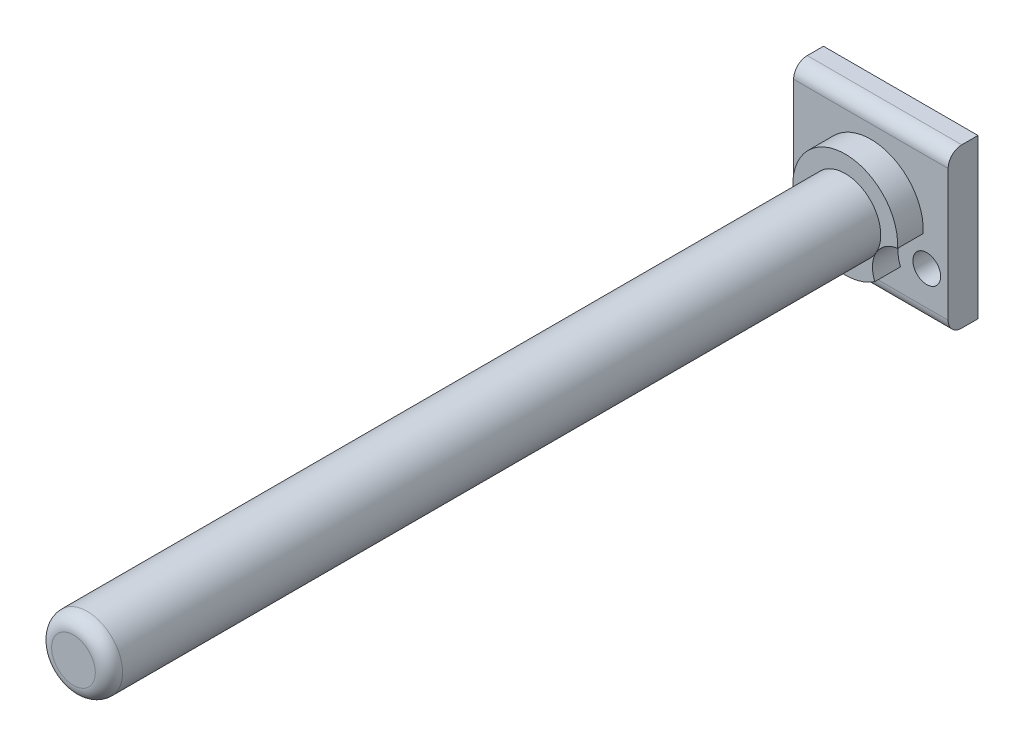
ISO-10303-21;
HEADER;
FILE_DESCRIPTION(('STEP AP214'),'2;1');
FILE_NAME('part.step','',(''),(''),'','','');
FILE_SCHEMA(('AUTOMOTIVE_DESIGN { 1 0 10303 214 1 1 1 1 }'));
ENDSEC;
DATA;
#1=APPLICATION_CONTEXT('core data for automotive mechanical design processes');
#2=APPLICATION_PROTOCOL_DEFINITION('international standard','automotive_design',2000,#1);
#3=PRODUCT_CONTEXT('',#1,'mechanical');
#4=PRODUCT('Part','Part','',(#3));
#5=PRODUCT_RELATED_PRODUCT_CATEGORY('part','',(#4));
#6=PRODUCT_DEFINITION_FORMATION('','',#4);
#7=PRODUCT_DEFINITION_CONTEXT('part definition',#1,'design');
#8=PRODUCT_DEFINITION('design','',#6,#7);
#9=PRODUCT_DEFINITION_SHAPE('','',#8);
#10=(LENGTH_UNIT() NAMED_UNIT(*) SI_UNIT(.MILLI.,.METRE.));
#11=(NAMED_UNIT(*) PLANE_ANGLE_UNIT() SI_UNIT($,.RADIAN.));
#12=(NAMED_UNIT(*) SI_UNIT($,.STERADIAN.) SOLID_ANGLE_UNIT());
#13=UNCERTAINTY_MEASURE_WITH_UNIT(LENGTH_MEASURE(1.E-05),#10,'distance_accuracy_value','');
#14=(GEOMETRIC_REPRESENTATION_CONTEXT(3) GLOBAL_UNCERTAINTY_ASSIGNED_CONTEXT((#13)) GLOBAL_UNIT_ASSIGNED_CONTEXT((#10,
#11,#12)) REPRESENTATION_CONTEXT('',''));
#15=CARTESIAN_POINT('',(0.,0.,0.));
#16=DIRECTION('',(0.,0.,1.));
#17=DIRECTION('',(1.,0.,0.));
#18=AXIS2_PLACEMENT_3D('',#15,#16,#17);
#19=CARTESIAN_POINT('',(0.,0.,3.5));
#20=DIRECTION('',(0.,0.,1.));
#21=DIRECTION('',(1.,0.,0.));
#22=AXIS2_PLACEMENT_3D('',#19,#20,#21);
#23=CYLINDRICAL_SURFACE('',#22,4.16);
#24=CARTESIAN_POINT('',(0.,0.,95.3));
#25=DIRECTION('',(0.,0.,1.));
#26=DIRECTION('',(1.,0.,0.));
#27=AXIS2_PLACEMENT_3D('',#24,#25,#26);
#28=CIRCLE('',#27,4.16);
#29=CARTESIAN_POINT('',(4.16,0.,95.3));
#30=VERTEX_POINT('',#29);
#31=EDGE_CURVE('E318',#30,#30,#28,.F.);
#32=ORIENTED_EDGE('',*,*,#31,.T.);
#33=EDGE_LOOP('',(#32));
#34=FACE_BOUND('',#33,.T.);
#35=CARTESIAN_POINT('',(0.,0.,6.5));
#36=DIRECTION('',(0.,0.,1.));
#37=DIRECTION('',(1.,0.,0.));
#38=AXIS2_PLACEMENT_3D('',#35,#36,#37);
#39=CIRCLE('',#38,4.16);
#40=CARTESIAN_POINT('',(3.62087198898362,-2.04814209453196,6.5));
#41=VERTEX_POINT('',#40);
#42=CARTESIAN_POINT('',(-3.62087198898362,-2.04814209453196,6.5));
#43=VERTEX_POINT('',#42);
#44=EDGE_CURVE('E192',#41,#43,#39,.T.);
#45=ORIENTED_EDGE('',*,*,#44,.T.);
#46=CARTESIAN_POINT('',(0.,0.,6.5));
#47=DIRECTION('',(0.,0.,1.));
#48=DIRECTION('',(1.,0.,0.));
#49=AXIS2_PLACEMENT_3D('',#46,#47,#48);
#50=CIRCLE('',#49,4.16);
#51=EDGE_CURVE('E176',#43,#41,#50,.T.);
#52=ORIENTED_EDGE('',*,*,#51,.T.);
#53=EDGE_LOOP('',(#45,#52));
#54=FACE_BOUND('',#53,.T.);
#55=ADVANCED_FACE('F16',(#34,#54),#23,.T.);
#56=CARTESIAN_POINT('',(6.55,-9.3,1.9));
#57=DIRECTION('',(0.,-1.,0.));
#58=DIRECTION('',(0.,0.,-1.));
#59=AXIS2_PLACEMENT_3D('',#56,#57,#58);
#60=PLANE('',#59);
#61=DIRECTION('',(0.,0.,-1.));
#62=VECTOR('',#61,1.);
#63=CARTESIAN_POINT('',(9.05,-9.3,1.9));
#64=LINE('',#63,#62);
#65=CARTESIAN_POINT('',(9.05,-9.3,1.9));
#66=VERTEX_POINT('',#65);
#67=CARTESIAN_POINT('',(9.05,-9.3,0.));
#68=VERTEX_POINT('',#67);
#69=EDGE_CURVE('E292',#66,#68,#64,.T.);
#70=ORIENTED_EDGE('',*,*,#69,.F.);
#71=DIRECTION('',(-1.,0.,0.));
#72=VECTOR('',#71,1.);
#73=CARTESIAN_POINT('',(6.55,-9.3,1.9));
#74=LINE('',#73,#72);
#75=CARTESIAN_POINT('',(4.05,-9.3,1.9));
#76=VERTEX_POINT('',#75);
#77=EDGE_CURVE('E10',#66,#76,#74,.T.);
#78=ORIENTED_EDGE('',*,*,#77,.T.);
#79=DIRECTION('',(0.,0.,-1.));
#80=VECTOR('',#79,1.);
#81=CARTESIAN_POINT('',(4.05,-9.3,1.9));
#82=LINE('',#81,#80);
#83=CARTESIAN_POINT('',(4.05,-9.3,0.));
#84=VERTEX_POINT('',#83);
#85=EDGE_CURVE('E295',#76,#84,#82,.T.);
#86=ORIENTED_EDGE('',*,*,#85,.T.);
#87=DIRECTION('',(-1.,0.,0.));
#88=VECTOR('',#87,1.);
#89=CARTESIAN_POINT('',(6.55,-9.3,0.));
#90=LINE('',#89,#88);
#91=EDGE_CURVE('E283',#68,#84,#90,.T.);
#92=ORIENTED_EDGE('',*,*,#91,.F.);
#93=EDGE_LOOP('',(#70,#78,#86,#92));
#94=FACE_BOUND('',#93,.T.);
#95=ADVANCED_FACE('F385',(#94),#60,.T.);
#96=CARTESIAN_POINT('',(0.,0.,0.));
#97=DIRECTION('',(0.,0.,1.));
#98=DIRECTION('',(1.,0.,0.));
#99=AXIS2_PLACEMENT_3D('',#96,#97,#98);
#100=PLANE('',#99);
#101=DIRECTION('',(-1.,0.,0.));
#102=VECTOR('',#101,1.);
#103=CARTESIAN_POINT('',(0.,9.3,0.));
#104=LINE('',#103,#102);
#105=CARTESIAN_POINT('',(9.05,9.3,0.));
#106=VERTEX_POINT('',#105);
#107=CARTESIAN_POINT('',(-9.05,9.3,0.));
#108=VERTEX_POINT('',#107);
#109=EDGE_CURVE('E264',#106,#108,#104,.T.);
#110=ORIENTED_EDGE('',*,*,#109,.F.);
#111=DIRECTION('',(0.,-1.,0.));
#112=VECTOR('',#111,1.);
#113=CARTESIAN_POINT('',(9.05,0.,0.));
#114=LINE('',#113,#112);
#115=EDGE_CURVE('E253',#106,#68,#114,.T.);
#116=ORIENTED_EDGE('',*,*,#115,.T.);
#117=ORIENTED_EDGE('',*,*,#91,.T.);
#118=DIRECTION('',(0.,1.,0.));
#119=VECTOR('',#118,1.);
#120=CARTESIAN_POINT('',(4.05,-2.775,0.));
#121=LINE('',#120,#119);
#122=CARTESIAN_POINT('',(4.05,3.75,0.));
#123=VERTEX_POINT('',#122);
#124=EDGE_CURVE('E279',#84,#123,#121,.T.);
#125=ORIENTED_EDGE('',*,*,#124,.T.);
#126=DIRECTION('',(1.,0.,0.));
#127=VECTOR('',#126,1.);
#128=CARTESIAN_POINT('',(0.,3.75,0.));
#129=LINE('',#128,#127);
#130=CARTESIAN_POINT('',(-4.05,3.75,0.));
#131=VERTEX_POINT('',#130);
#132=EDGE_CURVE('E248',#131,#123,#129,.T.);
#133=ORIENTED_EDGE('',*,*,#132,.F.);
#134=DIRECTION('',(0.,1.,0.));
#135=VECTOR('',#134,1.);
#136=CARTESIAN_POINT('',(-4.05,-2.775,0.));
#137=LINE('',#136,#135);
#138=CARTESIAN_POINT('',(-4.05,-9.3,0.));
#139=VERTEX_POINT('',#138);
#140=EDGE_CURVE('E268',#139,#131,#137,.T.);
#141=ORIENTED_EDGE('',*,*,#140,.F.);
#142=DIRECTION('',(-1.,0.,0.));
#143=VECTOR('',#142,1.);
#144=CARTESIAN_POINT('',(-6.55,-9.3,0.));
#145=LINE('',#144,#143);
#146=CARTESIAN_POINT('',(-9.05,-9.3,0.));
#147=VERTEX_POINT('',#146);
#148=EDGE_CURVE('E275',#139,#147,#145,.T.);
#149=ORIENTED_EDGE('',*,*,#148,.T.);
#150=DIRECTION('',(0.,-1.,0.));
#151=VECTOR('',#150,1.);
#152=CARTESIAN_POINT('',(-9.05,0.,0.));
#153=LINE('',#152,#151);
#154=EDGE_CURVE('E271',#108,#147,#153,.T.);
#155=ORIENTED_EDGE('',*,*,#154,.F.);
#156=EDGE_LOOP('',(#110,#116,#117,#125,#133,#141,#149,#155));
#157=FACE_BOUND('',#156,.T.);
#158=CARTESIAN_POINT('',(-6.55,-3.705,0.));
#159=DIRECTION('',(0.,0.,1.));
#160=DIRECTION('',(-1.,0.,0.));
#161=AXIS2_PLACEMENT_3D('',#158,#159,#160);
#162=CIRCLE('',#161,1.625);
#163=CARTESIAN_POINT('',(-8.175,-3.705,0.));
#164=VERTEX_POINT('',#163);
#165=EDGE_CURVE('E231',#164,#164,#162,.T.);
#166=ORIENTED_EDGE('',*,*,#165,.T.);
#167=EDGE_LOOP('',(#166));
#168=FACE_BOUND('',#167,.T.);
#169=CARTESIAN_POINT('',(6.55,-3.705,0.));
#170=DIRECTION('',(0.,0.,-1.));
#171=DIRECTION('',(-1.,0.,0.));
#172=AXIS2_PLACEMENT_3D('',#169,#170,#171);
#173=CIRCLE('',#172,1.625);
#174=CARTESIAN_POINT('',(4.925,-3.705,0.));
#175=VERTEX_POINT('',#174);
#176=EDGE_CURVE('E222',#175,#175,#173,.T.);
#177=ORIENTED_EDGE('',*,*,#176,.F.);
#178=EDGE_LOOP('',(#177));
#179=FACE_BOUND('',#178,.T.);
#180=ADVANCED_FACE('F381',(#157,#168,#179),#100,.F.);
#181=CARTESIAN_POINT('',(0.,0.,3.5));
#182=DIRECTION('',(0.,0.,1.));
#183=DIRECTION('',(1.,0.,0.));
#184=AXIS2_PLACEMENT_3D('',#181,#182,#183);
#185=PLANE('',#184);
#186=CARTESIAN_POINT('',(6.55,-3.705,3.5));
#187=DIRECTION('',(0.,0.,1.));
#188=DIRECTION('',(1.,0.,0.));
#189=AXIS2_PLACEMENT_3D('',#186,#187,#188);
#190=CIRCLE('',#189,3.36525913175088);
#191=CARTESIAN_POINT('',(3.47152484465347,-5.06439683012239,3.5));
#192=VERTEX_POINT('',#191);
#193=CARTESIAN_POINT('',(6.12907169299886,-0.366169608351176,3.5));
#194=VERTEX_POINT('',#193);
#195=EDGE_CURVE('E214',#192,#194,#190,.F.);
#196=ORIENTED_EDGE('',*,*,#195,.F.);
#197=CARTESIAN_POINT('',(0.,0.,3.5));
#198=DIRECTION('',(0.,0.,1.));
#199=DIRECTION('',(1.,0.,0.));
#200=AXIS2_PLACEMENT_3D('',#197,#198,#199);
#201=CIRCLE('',#200,6.14);
#202=CARTESIAN_POINT('',(-3.47152484465347,-5.06439683012239,3.5));
#203=VERTEX_POINT('',#202);
#204=EDGE_CURVE('E187',#192,#203,#201,.F.);
#205=ORIENTED_EDGE('',*,*,#204,.T.);
#206=CARTESIAN_POINT('',(-6.55,-3.705,3.5));
#207=DIRECTION('',(0.,0.,1.));
#208=DIRECTION('',(1.,0.,0.));
#209=AXIS2_PLACEMENT_3D('',#206,#207,#208);
#210=CIRCLE('',#209,3.36525913175088);
#211=CARTESIAN_POINT('',(-6.12907169299886,-0.366169608351175,3.5));
#212=VERTEX_POINT('',#211);
#213=EDGE_CURVE('E37',#212,#203,#210,.F.);
#214=ORIENTED_EDGE('',*,*,#213,.F.);
#215=CARTESIAN_POINT('',(0.,0.,3.5));
#216=DIRECTION('',(0.,0.,1.));
#217=DIRECTION('',(1.,0.,0.));
#218=AXIS2_PLACEMENT_3D('',#215,#216,#217);
#219=CIRCLE('',#218,6.14);
#220=EDGE_CURVE('E215',#212,#194,#219,.F.);
#221=ORIENTED_EDGE('',*,*,#220,.T.);
#222=EDGE_LOOP('',(#196,#205,#214,#221));
#223=FACE_BOUND('',#222,.T.);
#224=CARTESIAN_POINT('',(-6.55,-3.705,3.5));
#225=DIRECTION('',(0.,0.,1.));
#226=DIRECTION('',(1.,0.,0.));
#227=AXIS2_PLACEMENT_3D('',#224,#225,#226);
#228=CIRCLE('',#227,1.625);
#229=CARTESIAN_POINT('',(-4.925,-3.705,3.5));
#230=VERTEX_POINT('',#229);
#231=EDGE_CURVE('E218',#230,#230,#228,.T.);
#232=ORIENTED_EDGE('',*,*,#231,.F.);
#233=EDGE_LOOP('',(#232));
#234=FACE_BOUND('',#233,.T.);
#235=DIRECTION('',(0.,-1.,0.));
#236=VECTOR('',#235,1.);
#237=CARTESIAN_POINT('',(9.05,0.,3.5));
#238=LINE('',#237,#236);
#239=CARTESIAN_POINT('',(9.05,7.7,3.5));
#240=VERTEX_POINT('',#239);
#241=CARTESIAN_POINT('',(9.05,-7.7,3.5));
#242=VERTEX_POINT('',#241);
#243=EDGE_CURVE('E226',#240,#242,#238,.T.);
#244=ORIENTED_EDGE('',*,*,#243,.F.);
#245=DIRECTION('',(-1.,0.,0.));
#246=VECTOR('',#245,1.);
#247=CARTESIAN_POINT('',(-9.05,7.7,3.5));
#248=LINE('',#247,#246);
#249=CARTESIAN_POINT('',(-9.05,7.7,3.5));
#250=VERTEX_POINT('',#249);
#251=EDGE_CURVE('E325',#240,#250,#248,.T.);
#252=ORIENTED_EDGE('',*,*,#251,.T.);
#253=DIRECTION('',(0.,-1.,0.));
#254=VECTOR('',#253,1.);
#255=CARTESIAN_POINT('',(-9.05,0.,3.5));
#256=LINE('',#255,#254);
#257=CARTESIAN_POINT('',(-9.05,-7.7,3.5));
#258=VERTEX_POINT('',#257);
#259=EDGE_CURVE('E241',#250,#258,#256,.T.);
#260=ORIENTED_EDGE('',*,*,#259,.T.);
#261=DIRECTION('',(-1.,0.,0.));
#262=VECTOR('',#261,1.);
#263=CARTESIAN_POINT('',(0.,-7.7,3.5));
#264=LINE('',#263,#262);
#265=EDGE_CURVE('E322',#258,#242,#264,.F.);
#266=ORIENTED_EDGE('',*,*,#265,.T.);
#267=EDGE_LOOP('',(#244,#252,#260,#266));
#268=FACE_BOUND('',#267,.T.);
#269=CARTESIAN_POINT('',(6.55,-3.705,3.5));
#270=DIRECTION('',(0.,0.,1.));
#271=DIRECTION('',(1.,0.,0.));
#272=AXIS2_PLACEMENT_3D('',#269,#270,#271);
#273=CIRCLE('',#272,1.625);
#274=CARTESIAN_POINT('',(8.175,-3.705,3.5));
#275=VERTEX_POINT('',#274);
#276=EDGE_CURVE('E227',#275,#275,#273,.F.);
#277=ORIENTED_EDGE('',*,*,#276,.T.);
#278=EDGE_LOOP('',(#277));
#279=FACE_BOUND('',#278,.T.);
#280=ADVANCED_FACE('F364',(#223,#234,#268,#279),#185,.T.);
#281=CARTESIAN_POINT('',(0.,9.3,1.9));
#282=DIRECTION('',(0.,-1.,0.));
#283=DIRECTION('',(0.,0.,-1.));
#284=AXIS2_PLACEMENT_3D('',#281,#282,#283);
#285=PLANE('',#284);
#286=DIRECTION('',(0.,0.,-1.));
#287=VECTOR('',#286,1.);
#288=CARTESIAN_POINT('',(-9.05,9.3,1.9));
#289=LINE('',#288,#287);
#290=CARTESIAN_POINT('',(-9.05,9.3,1.9));
#291=VERTEX_POINT('',#290);
#292=EDGE_CURVE('E306',#291,#108,#289,.T.);
#293=ORIENTED_EDGE('',*,*,#292,.F.);
#294=DIRECTION('',(-1.,0.,0.));
#295=VECTOR('',#294,1.);
#296=CARTESIAN_POINT('',(9.05,9.3,1.9));
#297=LINE('',#296,#295);
#298=CARTESIAN_POINT('',(9.05,9.3,1.9));
#299=VERTEX_POINT('',#298);
#300=EDGE_CURVE('E335',#291,#299,#297,.F.);
#301=ORIENTED_EDGE('',*,*,#300,.T.);
#302=DIRECTION('',(0.,0.,-1.));
#303=VECTOR('',#302,1.);
#304=CARTESIAN_POINT('',(9.05,9.3,1.9));
#305=LINE('',#304,#303);
#306=EDGE_CURVE('E260',#299,#106,#305,.T.);
#307=ORIENTED_EDGE('',*,*,#306,.T.);
#308=ORIENTED_EDGE('',*,*,#109,.T.);
#309=EDGE_LOOP('',(#293,#301,#307,#308));
#310=FACE_BOUND('',#309,.T.);
#311=ADVANCED_FACE('F378',(#310),#285,.F.);
#312=CARTESIAN_POINT('',(-9.05,0.,1.9));
#313=DIRECTION('',(1.,0.,0.));
#314=DIRECTION('',(0.,0.,-1.));
#315=AXIS2_PLACEMENT_3D('',#312,#313,#314);
#316=PLANE('',#315);
#317=ORIENTED_EDGE('',*,*,#259,.F.);
#318=CARTESIAN_POINT('',(-9.05,7.7,1.9));
#319=DIRECTION('',(1.,0.,0.));
#320=DIRECTION('',(0.,0.,-1.));
#321=AXIS2_PLACEMENT_3D('',#318,#319,#320);
#322=CIRCLE('',#321,1.6);
#323=EDGE_CURVE('E332',#250,#291,#322,.F.);
#324=ORIENTED_EDGE('',*,*,#323,.T.);
#325=ORIENTED_EDGE('',*,*,#292,.T.);
#326=ORIENTED_EDGE('',*,*,#154,.T.);
#327=DIRECTION('',(0.,0.,-1.));
#328=VECTOR('',#327,1.);
#329=CARTESIAN_POINT('',(-9.05,-9.3,1.9));
#330=LINE('',#329,#328);
#331=CARTESIAN_POINT('',(-9.05,-9.3,1.9));
#332=VERTEX_POINT('',#331);
#333=EDGE_CURVE('E302',#332,#147,#330,.T.);
#334=ORIENTED_EDGE('',*,*,#333,.F.);
#335=CARTESIAN_POINT('',(-9.05,-7.7,1.9));
#336=DIRECTION('',(1.,0.,0.));
#337=DIRECTION('',(0.,0.,-1.));
#338=AXIS2_PLACEMENT_3D('',#335,#336,#337);
#339=CIRCLE('',#338,1.6);
#340=EDGE_CURVE('E329',#332,#258,#339,.F.);
#341=ORIENTED_EDGE('',*,*,#340,.T.);
#342=EDGE_LOOP('',(#317,#324,#325,#326,#334,#341));
#343=FACE_BOUND('',#342,.T.);
#344=ADVANCED_FACE('F357',(#343),#316,.F.);
#345=DIRECTION('',(0.,0.,-1.));
#346=VECTOR('',#345,1.);
#347=CARTESIAN_POINT('',(-4.05,-9.3,1.9));
#348=LINE('',#347,#346);
#349=CARTESIAN_POINT('',(-4.05,-9.3,1.9));
#350=VERTEX_POINT('',#349);
#351=EDGE_CURVE('E299',#350,#139,#348,.T.);
#352=ORIENTED_EDGE('',*,*,#351,.F.);
#353=DIRECTION('',(-1.,0.,0.));
#354=VECTOR('',#353,1.);
#355=CARTESIAN_POINT('',(6.55,-9.3,1.9));
#356=LINE('',#355,#354);
#357=EDGE_CURVE('E25',#350,#332,#356,.T.);
#358=ORIENTED_EDGE('',*,*,#357,.T.);
#359=ORIENTED_EDGE('',*,*,#333,.T.);
#360=ORIENTED_EDGE('',*,*,#148,.F.);
#361=EDGE_LOOP('',(#352,#358,#359,#360));
#362=FACE_BOUND('',#361,.T.);
#363=ADVANCED_FACE('F350',(#362),#60,.T.);
#364=CARTESIAN_POINT('',(9.05,0.,1.9));
#365=DIRECTION('',(1.,0.,0.));
#366=DIRECTION('',(0.,0.,-1.));
#367=AXIS2_PLACEMENT_3D('',#364,#365,#366);
#368=PLANE('',#367);
#369=ORIENTED_EDGE('',*,*,#306,.F.);
#370=CARTESIAN_POINT('',(9.05,7.7,1.9));
#371=DIRECTION('',(1.,0.,0.));
#372=DIRECTION('',(0.,0.,-1.));
#373=AXIS2_PLACEMENT_3D('',#370,#371,#372);
#374=CIRCLE('',#373,1.6);
#375=EDGE_CURVE('E341',#299,#240,#374,.T.);
#376=ORIENTED_EDGE('',*,*,#375,.T.);
#377=ORIENTED_EDGE('',*,*,#243,.T.);
#378=CARTESIAN_POINT('',(9.05,-7.7,1.9));
#379=DIRECTION('',(1.,0.,0.));
#380=DIRECTION('',(0.,0.,-1.));
#381=AXIS2_PLACEMENT_3D('',#378,#379,#380);
#382=CIRCLE('',#381,1.6);
#383=EDGE_CURVE('E338',#242,#66,#382,.T.);
#384=ORIENTED_EDGE('',*,*,#383,.T.);
#385=ORIENTED_EDGE('',*,*,#69,.T.);
#386=ORIENTED_EDGE('',*,*,#115,.F.);
#387=EDGE_LOOP('',(#369,#376,#377,#384,#385,#386));
#388=FACE_BOUND('',#387,.T.);
#389=ADVANCED_FACE('F369',(#388),#368,.T.);
#390=CARTESIAN_POINT('',(-4.05,-2.775,1.9));
#391=DIRECTION('',(-1.,0.,0.));
#392=DIRECTION('',(0.,0.,1.));
#393=AXIS2_PLACEMENT_3D('',#390,#391,#392);
#394=PLANE('',#393);
#395=ORIENTED_EDGE('',*,*,#140,.T.);
#396=DIRECTION('',(0.,0.,-1.));
#397=VECTOR('',#396,1.);
#398=CARTESIAN_POINT('',(-4.05,3.75,1.9));
#399=LINE('',#398,#397);
#400=CARTESIAN_POINT('',(-4.05,3.75,1.9));
#401=VERTEX_POINT('',#400);
#402=EDGE_CURVE('E303',#401,#131,#399,.T.);
#403=ORIENTED_EDGE('',*,*,#402,.F.);
#404=DIRECTION('',(0.,1.,0.));
#405=VECTOR('',#404,1.);
#406=CARTESIAN_POINT('',(-4.05,-2.775,1.9));
#407=LINE('',#406,#405);
#408=EDGE_CURVE('E252',#350,#401,#407,.T.);
#409=ORIENTED_EDGE('',*,*,#408,.F.);
#410=ORIENTED_EDGE('',*,*,#351,.T.);
#411=EDGE_LOOP('',(#395,#403,#409,#410));
#412=FACE_BOUND('',#411,.T.);
#413=ADVANCED_FACE('F399',(#412),#394,.F.);
#414=CARTESIAN_POINT('',(0.,3.75,1.9));
#415=DIRECTION('',(0.,1.,0.));
#416=DIRECTION('',(-1.,0.,0.));
#417=AXIS2_PLACEMENT_3D('',#414,#415,#416);
#418=PLANE('',#417);
#419=ORIENTED_EDGE('',*,*,#132,.T.);
#420=DIRECTION('',(0.,0.,-1.));
#421=VECTOR('',#420,1.);
#422=CARTESIAN_POINT('',(4.05,3.75,1.9));
#423=LINE('',#422,#421);
#424=CARTESIAN_POINT('',(4.05,3.75,1.9));
#425=VERTEX_POINT('',#424);
#426=EDGE_CURVE('E298',#425,#123,#423,.T.);
#427=ORIENTED_EDGE('',*,*,#426,.F.);
#428=DIRECTION('',(1.,0.,0.));
#429=VECTOR('',#428,1.);
#430=CARTESIAN_POINT('',(0.,3.75,1.9));
#431=LINE('',#430,#429);
#432=EDGE_CURVE('E249',#401,#425,#431,.T.);
#433=ORIENTED_EDGE('',*,*,#432,.F.);
#434=ORIENTED_EDGE('',*,*,#402,.T.);
#435=EDGE_LOOP('',(#419,#427,#433,#434));
#436=FACE_BOUND('',#435,.T.);
#437=ADVANCED_FACE('F396',(#436),#418,.F.);
#438=CARTESIAN_POINT('',(4.05,-2.775,1.9));
#439=DIRECTION('',(-1.,0.,0.));
#440=DIRECTION('',(0.,-1.,0.));
#441=AXIS2_PLACEMENT_3D('',#438,#439,#440);
#442=PLANE('',#441);
#443=ORIENTED_EDGE('',*,*,#124,.F.);
#444=ORIENTED_EDGE('',*,*,#85,.F.);
#445=DIRECTION('',(0.,1.,0.));
#446=VECTOR('',#445,1.);
#447=CARTESIAN_POINT('',(4.05,-2.775,1.9));
#448=LINE('',#447,#446);
#449=EDGE_CURVE('E256',#76,#425,#448,.T.);
#450=ORIENTED_EDGE('',*,*,#449,.T.);
#451=ORIENTED_EDGE('',*,*,#426,.T.);
#452=EDGE_LOOP('',(#443,#444,#450,#451));
#453=FACE_BOUND('',#452,.T.);
#454=ADVANCED_FACE('F391',(#453),#442,.T.);
#455=CARTESIAN_POINT('',(0.,0.,1.9));
#456=DIRECTION('',(0.,0.,1.));
#457=DIRECTION('',(1.,0.,0.));
#458=AXIS2_PLACEMENT_3D('',#455,#456,#457);
#459=PLANE('',#458);
#460=DIRECTION('',(-1.,0.,0.));
#461=VECTOR('',#460,1.);
#462=CARTESIAN_POINT('',(-6.55,-9.3,1.9));
#463=LINE('',#462,#461);
#464=EDGE_CURVE('E245',#76,#350,#463,.T.);
#465=ORIENTED_EDGE('',*,*,#464,.T.);
#466=ORIENTED_EDGE('',*,*,#408,.T.);
#467=ORIENTED_EDGE('',*,*,#432,.T.);
#468=ORIENTED_EDGE('',*,*,#449,.F.);
#469=EDGE_LOOP('',(#465,#466,#467,#468));
#470=FACE_BOUND('',#469,.T.);
#471=ADVANCED_FACE('F401',(#470),#459,.F.);
#472=CARTESIAN_POINT('',(0.,0.,96.9));
#473=DIRECTION('',(0.,0.,1.));
#474=DIRECTION('',(1.,0.,0.));
#475=AXIS2_PLACEMENT_3D('',#472,#473,#474);
#476=PLANE('',#475);
#477=CARTESIAN_POINT('',(0.,0.,96.9));
#478=DIRECTION('',(0.,0.,1.));
#479=DIRECTION('',(1.,0.,0.));
#480=AXIS2_PLACEMENT_3D('',#477,#478,#479);
#481=CIRCLE('',#480,2.56);
#482=CARTESIAN_POINT('',(2.56,0.,96.9));
#483=VERTEX_POINT('',#482);
#484=EDGE_CURVE('E309',#483,#483,#481,.T.);
#485=ORIENTED_EDGE('',*,*,#484,.T.);
#486=EDGE_LOOP('',(#485));
#487=FACE_BOUND('',#486,.T.);
#488=ADVANCED_FACE('F403',(#487),#476,.T.);
#489=CARTESIAN_POINT('',(-6.55,-3.705,96.902));
#490=DIRECTION('',(0.,0.,-1.));
#491=DIRECTION('',(-1.,0.,0.));
#492=AXIS2_PLACEMENT_3D('',#489,#490,#491);
#493=CYLINDRICAL_SURFACE('',#492,1.625);
#494=ORIENTED_EDGE('',*,*,#165,.F.);
#495=EDGE_LOOP('',(#494));
#496=FACE_BOUND('',#495,.T.);
#497=ORIENTED_EDGE('',*,*,#231,.T.);
#498=EDGE_LOOP('',(#497));
#499=FACE_BOUND('',#498,.T.);
#500=ADVANCED_FACE('F410',(#496,#499),#493,.F.);
#501=CARTESIAN_POINT('',(6.55,-3.705,96.902));
#502=DIRECTION('',(0.,0.,-1.));
#503=DIRECTION('',(-1.,0.,0.));
#504=AXIS2_PLACEMENT_3D('',#501,#502,#503);
#505=CYLINDRICAL_SURFACE('',#504,1.625);
#506=ORIENTED_EDGE('',*,*,#176,.T.);
#507=EDGE_LOOP('',(#506));
#508=FACE_BOUND('',#507,.T.);
#509=ORIENTED_EDGE('',*,*,#276,.F.);
#510=EDGE_LOOP('',(#509));
#511=FACE_BOUND('',#510,.T.);
#512=ADVANCED_FACE('F428',(#508,#511),#505,.F.);
#513=CARTESIAN_POINT('',(0.,0.,95.3));
#514=DIRECTION('',(0.,0.,1.));
#515=DIRECTION('',(1.,0.,0.));
#516=AXIS2_PLACEMENT_3D('',#513,#514,#515);
#517=TOROIDAL_SURFACE('',#516,2.56,1.6);
#518=ORIENTED_EDGE('',*,*,#31,.F.);
#519=EDGE_LOOP('',(#518));
#520=FACE_BOUND('',#519,.T.);
#521=ORIENTED_EDGE('',*,*,#484,.F.);
#522=EDGE_LOOP('',(#521));
#523=FACE_BOUND('',#522,.T.);
#524=ADVANCED_FACE('F432',(#520,#523),#517,.T.);
#525=CARTESIAN_POINT('',(0.,7.7,1.9));
#526=DIRECTION('',(1.,0.,0.));
#527=DIRECTION('',(0.,0.,-1.));
#528=AXIS2_PLACEMENT_3D('',#525,#526,#527);
#529=CYLINDRICAL_SURFACE('',#528,1.6);
#530=ORIENTED_EDGE('',*,*,#375,.F.);
#531=ORIENTED_EDGE('',*,*,#300,.F.);
#532=ORIENTED_EDGE('',*,*,#323,.F.);
#533=ORIENTED_EDGE('',*,*,#251,.F.);
#534=EDGE_LOOP('',(#530,#531,#532,#533));
#535=FACE_BOUND('',#534,.T.);
#536=ADVANCED_FACE('F375',(#535),#529,.T.);
#537=CARTESIAN_POINT('',(6.55,-7.7,1.9));
#538=DIRECTION('',(-1.,0.,0.));
#539=DIRECTION('',(0.,0.,1.));
#540=AXIS2_PLACEMENT_3D('',#537,#538,#539);
#541=CYLINDRICAL_SURFACE('',#540,1.6);
#542=ORIENTED_EDGE('',*,*,#383,.F.);
#543=ORIENTED_EDGE('',*,*,#265,.F.);
#544=ORIENTED_EDGE('',*,*,#340,.F.);
#545=ORIENTED_EDGE('',*,*,#357,.F.);
#546=ORIENTED_EDGE('',*,*,#464,.F.);
#547=ORIENTED_EDGE('',*,*,#77,.F.);
#548=EDGE_LOOP('',(#542,#543,#544,#545,#546,#547));
#549=FACE_BOUND('',#548,.T.);
#550=ADVANCED_FACE('F18',(#549),#541,.T.);
#551=CARTESIAN_POINT('',(-6.55,-3.705,-0.00200000000000027));
#552=DIRECTION('',(0.,0.,1.));
#553=DIRECTION('',(1.,0.,0.));
#554=AXIS2_PLACEMENT_3D('',#551,#552,#553);
#555=CYLINDRICAL_SURFACE('',#554,3.36525913175088);
#556=DIRECTION('',(0.,0.,1.));
#557=VECTOR('',#556,1.);
#558=CARTESIAN_POINT('',(-6.12907169299886,-0.366169608351175,-0.00200000000000027));
#559=LINE('',#558,#557);
#560=CARTESIAN_POINT('',(-6.12907169299886,-0.366169608351175,6.5));
#561=VERTEX_POINT('',#560);
#562=EDGE_CURVE('E206',#212,#561,#559,.T.);
#563=ORIENTED_EDGE('',*,*,#562,.F.);
#564=ORIENTED_EDGE('',*,*,#213,.T.);
#565=DIRECTION('',(0.,0.,1.));
#566=VECTOR('',#565,1.);
#567=CARTESIAN_POINT('',(-3.47152484465347,-5.06439683012239,-0.00200000000000027));
#568=LINE('',#567,#566);
#569=CARTESIAN_POINT('',(-3.47152484465347,-5.06439683012239,6.5));
#570=VERTEX_POINT('',#569);
#571=EDGE_CURVE('E156',#203,#570,#568,.T.);
#572=ORIENTED_EDGE('',*,*,#571,.T.);
#573=CARTESIAN_POINT('',(-6.55,-3.705,6.5));
#574=DIRECTION('',(0.,0.,1.));
#575=DIRECTION('',(1.,0.,0.));
#576=AXIS2_PLACEMENT_3D('',#573,#574,#575);
#577=CIRCLE('',#576,3.36525913175089);
#578=EDGE_CURVE('E161',#570,#43,#577,.T.);
#579=ORIENTED_EDGE('',*,*,#578,.T.);
#580=CARTESIAN_POINT('',(-6.55,-3.705,6.5));
#581=DIRECTION('',(0.,0.,1.));
#582=DIRECTION('',(1.,0.,0.));
#583=AXIS2_PLACEMENT_3D('',#580,#581,#582);
#584=CIRCLE('',#583,3.36525913175088);
#585=EDGE_CURVE('E203',#43,#561,#584,.T.);
#586=ORIENTED_EDGE('',*,*,#585,.T.);
#587=EDGE_LOOP('',(#563,#564,#572,#579,#586));
#588=FACE_BOUND('',#587,.T.);
#589=ADVANCED_FACE('F158',(#588),#555,.F.);
#590=CARTESIAN_POINT('',(0.,0.,-0.00200000000000027));
#591=DIRECTION('',(0.,0.,1.));
#592=DIRECTION('',(1.,0.,0.));
#593=AXIS2_PLACEMENT_3D('',#590,#591,#592);
#594=CYLINDRICAL_SURFACE('',#593,6.14);
#595=ORIENTED_EDGE('',*,*,#220,.F.);
#596=ORIENTED_EDGE('',*,*,#562,.T.);
#597=CARTESIAN_POINT('',(0.,0.,6.5));
#598=DIRECTION('',(0.,0.,1.));
#599=DIRECTION('',(1.,0.,0.));
#600=AXIS2_PLACEMENT_3D('',#597,#598,#599);
#601=CIRCLE('',#600,6.14);
#602=CARTESIAN_POINT('',(6.12907169299886,-0.366169608351175,6.5));
#603=VERTEX_POINT('',#602);
#604=EDGE_CURVE('E199',#603,#561,#601,.T.);
#605=ORIENTED_EDGE('',*,*,#604,.F.);
#606=DIRECTION('',(0.,0.,1.));
#607=VECTOR('',#606,1.);
#608=CARTESIAN_POINT('',(6.12907169299886,-0.366169608351175,-0.00200000000000027));
#609=LINE('',#608,#607);
#610=EDGE_CURVE('E209',#194,#603,#609,.T.);
#611=ORIENTED_EDGE('',*,*,#610,.F.);
#612=EDGE_LOOP('',(#595,#596,#605,#611));
#613=FACE_BOUND('',#612,.T.);
#614=ADVANCED_FACE('F438',(#613),#594,.T.);
#615=CARTESIAN_POINT('',(6.55,-3.705,-0.00200000000000027));
#616=DIRECTION('',(0.,0.,1.));
#617=DIRECTION('',(1.,0.,0.));
#618=AXIS2_PLACEMENT_3D('',#615,#616,#617);
#619=CYLINDRICAL_SURFACE('',#618,3.36525913175088);
#620=CARTESIAN_POINT('',(6.55,-3.705,6.5));
#621=DIRECTION('',(0.,0.,1.));
#622=DIRECTION('',(1.,0.,0.));
#623=AXIS2_PLACEMENT_3D('',#620,#621,#622);
#624=CIRCLE('',#623,3.36525913175088);
#625=EDGE_CURVE('E195',#603,#41,#624,.T.);
#626=ORIENTED_EDGE('',*,*,#625,.T.);
#627=CARTESIAN_POINT('',(6.55,-3.705,6.5));
#628=DIRECTION('',(0.,0.,1.));
#629=DIRECTION('',(1.,0.,0.));
#630=AXIS2_PLACEMENT_3D('',#627,#628,#629);
#631=CIRCLE('',#630,3.36525913175089);
#632=CARTESIAN_POINT('',(3.47152484465347,-5.06439683012239,6.5));
#633=VERTEX_POINT('',#632);
#634=EDGE_CURVE('E184',#41,#633,#631,.T.);
#635=ORIENTED_EDGE('',*,*,#634,.T.);
#636=DIRECTION('',(0.,0.,1.));
#637=VECTOR('',#636,1.);
#638=CARTESIAN_POINT('',(3.47152484465347,-5.06439683012239,-0.00200000000000027));
#639=LINE('',#638,#637);
#640=EDGE_CURVE('E166',#192,#633,#639,.T.);
#641=ORIENTED_EDGE('',*,*,#640,.F.);
#642=ORIENTED_EDGE('',*,*,#195,.T.);
#643=ORIENTED_EDGE('',*,*,#610,.T.);
#644=EDGE_LOOP('',(#626,#635,#641,#642,#643));
#645=FACE_BOUND('',#644,.T.);
#646=ADVANCED_FACE('F434',(#645),#619,.F.);
#647=CARTESIAN_POINT('',(0.,-0.46512956587544,6.5));
#648=DIRECTION('',(0.,0.,1.));
#649=DIRECTION('',(1.,0.,0.));
#650=AXIS2_PLACEMENT_3D('',#647,#648,#649);
#651=PLANE('',#650);
#652=ORIENTED_EDGE('',*,*,#44,.F.);
#653=ORIENTED_EDGE('',*,*,#625,.F.);
#654=ORIENTED_EDGE('',*,*,#604,.T.);
#655=ORIENTED_EDGE('',*,*,#585,.F.);
#656=EDGE_LOOP('',(#652,#653,#654,#655));
#657=FACE_BOUND('',#656,.T.);
#658=ADVANCED_FACE('F437',(#657),#651,.T.);
#659=CARTESIAN_POINT('',(0.,0.,-0.00200000000000027));
#660=DIRECTION('',(0.,0.,1.));
#661=DIRECTION('',(1.,0.,0.));
#662=AXIS2_PLACEMENT_3D('',#659,#660,#661);
#663=CYLINDRICAL_SURFACE('',#662,6.14);
#664=ORIENTED_EDGE('',*,*,#204,.F.);
#665=ORIENTED_EDGE('',*,*,#640,.T.);
#666=CARTESIAN_POINT('',(0.,0.,6.5));
#667=DIRECTION('',(0.,0.,1.));
#668=DIRECTION('',(1.,0.,0.));
#669=AXIS2_PLACEMENT_3D('',#666,#667,#668);
#670=CIRCLE('',#669,6.14);
#671=EDGE_CURVE('E169',#570,#633,#670,.T.);
#672=ORIENTED_EDGE('',*,*,#671,.F.);
#673=ORIENTED_EDGE('',*,*,#571,.F.);
#674=EDGE_LOOP('',(#664,#665,#672,#673));
#675=FACE_BOUND('',#674,.T.);
#676=ADVANCED_FACE('F170',(#675),#663,.T.);
#677=CARTESIAN_POINT('',(0.,-0.46512956587544,6.5));
#678=DIRECTION('',(0.,0.,1.));
#679=DIRECTION('',(1.,0.,0.));
#680=AXIS2_PLACEMENT_3D('',#677,#678,#679);
#681=PLANE('',#680);
#682=ORIENTED_EDGE('',*,*,#51,.F.);
#683=ORIENTED_EDGE('',*,*,#578,.F.);
#684=ORIENTED_EDGE('',*,*,#671,.T.);
#685=ORIENTED_EDGE('',*,*,#634,.F.);
#686=EDGE_LOOP('',(#682,#683,#684,#685));
#687=FACE_BOUND('',#686,.T.);
#688=ADVANCED_FACE('F178',(#687),#681,.T.);
#689=CLOSED_SHELL('',(#55,#95,#180,#280,#311,#344,#363,#389,#413,#437,#454,#471,#488,#500,#512,
#524,#536,#550,#589,#614,#646,#658,#676,#688));
#690=MANIFOLD_SOLID_BREP('B1',#689);
#691=ADVANCED_BREP_SHAPE_REPRESENTATION('',(#18,#690),#14);
#692=SHAPE_DEFINITION_REPRESENTATION(#9,#691);
ENDSEC;
END-ISO-10303-21;
